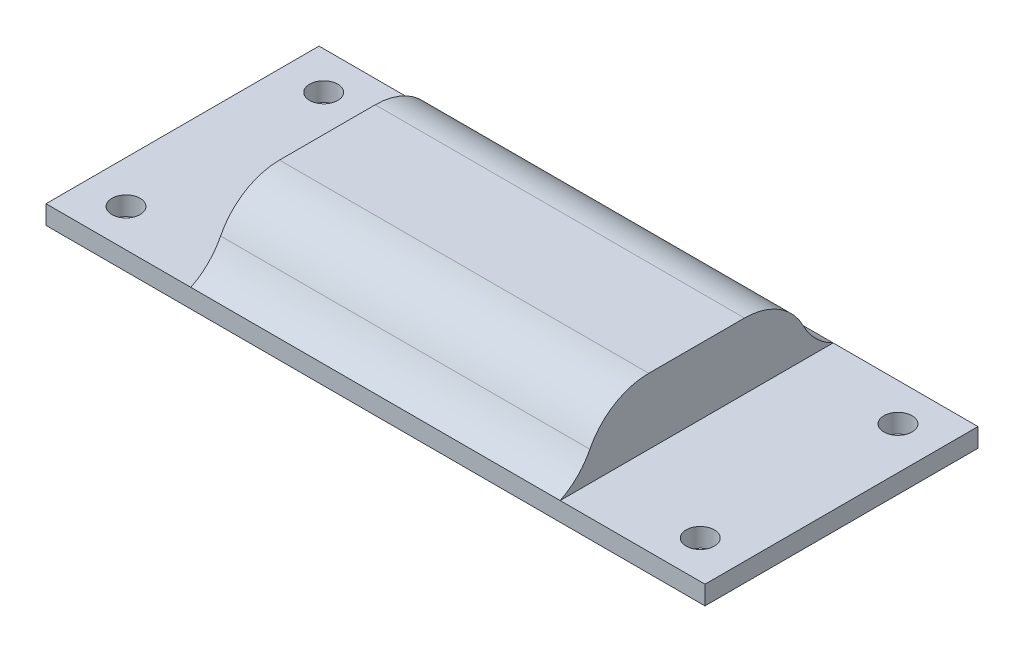
ISO-10303-21;
HEADER;
FILE_DESCRIPTION(('STEP AP214'),'2;1');
FILE_NAME('part.step','',(''),(''),'','','');
FILE_SCHEMA(('AUTOMOTIVE_DESIGN { 1 0 10303 214 1 1 1 1 }'));
ENDSEC;
DATA;
#1=APPLICATION_CONTEXT('core data for automotive mechanical design processes');
#2=APPLICATION_PROTOCOL_DEFINITION('international standard','automotive_design',2000,#1);
#3=PRODUCT_CONTEXT('',#1,'mechanical');
#4=PRODUCT('Part','Part','',(#3));
#5=PRODUCT_RELATED_PRODUCT_CATEGORY('part','',(#4));
#6=PRODUCT_DEFINITION_FORMATION('','',#4);
#7=PRODUCT_DEFINITION_CONTEXT('part definition',#1,'design');
#8=PRODUCT_DEFINITION('design','',#6,#7);
#9=PRODUCT_DEFINITION_SHAPE('','',#8);
#10=(LENGTH_UNIT() NAMED_UNIT(*) SI_UNIT(.MILLI.,.METRE.));
#11=(NAMED_UNIT(*) PLANE_ANGLE_UNIT() SI_UNIT($,.RADIAN.));
#12=(NAMED_UNIT(*) SI_UNIT($,.STERADIAN.) SOLID_ANGLE_UNIT());
#13=UNCERTAINTY_MEASURE_WITH_UNIT(LENGTH_MEASURE(1.E-05),#10,'distance_accuracy_value','');
#14=(GEOMETRIC_REPRESENTATION_CONTEXT(3) GLOBAL_UNCERTAINTY_ASSIGNED_CONTEXT((#13)) GLOBAL_UNIT_ASSIGNED_CONTEXT((#10,
#11,#12)) REPRESENTATION_CONTEXT('',''));
#15=CARTESIAN_POINT('',(0.,0.,0.));
#16=DIRECTION('',(0.,0.,1.));
#17=DIRECTION('',(1.,0.,0.));
#18=AXIS2_PLACEMENT_3D('',#15,#16,#17);
#19=CARTESIAN_POINT('',(0.,2.,0.));
#20=DIRECTION('',(0.,-1.,0.));
#21=DIRECTION('',(0.,0.,-1.));
#22=AXIS2_PLACEMENT_3D('',#19,#20,#21);
#23=PLANE('',#22);
#24=CARTESIAN_POINT('',(-30.499583195,2.,-10.498163925));
#25=DIRECTION('',(0.,1.,0.));
#26=DIRECTION('',(0.,0.,1.));
#27=AXIS2_PLACEMENT_3D('',#24,#25,#26);
#28=CIRCLE('',#27,1.5);
#29=CARTESIAN_POINT('',(-30.499583195,2.,-8.998163925));
#30=VERTEX_POINT('',#29);
#31=EDGE_CURVE('E202',#30,#30,#28,.T.);
#32=ORIENTED_EDGE('',*,*,#31,.F.);
#33=EDGE_LOOP('',(#32));
#34=FACE_BOUND('',#33,.T.);
#35=CARTESIAN_POINT('',(-30.499583195,2.,10.501836075));
#36=DIRECTION('',(0.,1.,0.));
#37=DIRECTION('',(0.,0.,1.));
#38=AXIS2_PLACEMENT_3D('',#35,#36,#37);
#39=CIRCLE('',#38,1.5);
#40=CARTESIAN_POINT('',(-30.499583195,2.,12.001836075));
#41=VERTEX_POINT('',#40);
#42=EDGE_CURVE('E227',#41,#41,#39,.T.);
#43=ORIENTED_EDGE('',*,*,#42,.F.);
#44=EDGE_LOOP('',(#43));
#45=FACE_BOUND('',#44,.T.);
#46=DIRECTION('',(0.,0.,1.));
#47=VECTOR('',#46,1.);
#48=CARTESIAN_POINT('',(-19.6126963921596,2.,-10.5983993965324));
#49=LINE('',#48,#47);
#50=CARTESIAN_POINT('',(-19.6126963921596,2.,-14.5));
#51=VERTEX_POINT('',#50);
#52=CARTESIAN_POINT('',(-19.6126963921596,2.,14.5));
#53=VERTEX_POINT('',#52);
#54=EDGE_CURVE('E247',#51,#53,#49,.T.);
#55=ORIENTED_EDGE('',*,*,#54,.F.);
#56=DIRECTION('',(-1.,0.,0.));
#57=VECTOR('',#56,1.);
#58=CARTESIAN_POINT('',(35.,2.,-14.5));
#59=LINE('',#58,#57);
#60=CARTESIAN_POINT('',(-35.,2.,-14.5));
#61=VERTEX_POINT('',#60);
#62=EDGE_CURVE('E135',#51,#61,#59,.T.);
#63=ORIENTED_EDGE('',*,*,#62,.T.);
#64=DIRECTION('',(0.,0.,1.));
#65=VECTOR('',#64,1.);
#66=CARTESIAN_POINT('',(-35.,2.,-14.5));
#67=LINE('',#66,#65);
#68=CARTESIAN_POINT('',(-35.,2.,14.5));
#69=VERTEX_POINT('',#68);
#70=EDGE_CURVE('E133',#61,#69,#67,.T.);
#71=ORIENTED_EDGE('',*,*,#70,.T.);
#72=DIRECTION('',(1.,0.,0.));
#73=VECTOR('',#72,1.);
#74=CARTESIAN_POINT('',(35.,2.,14.5));
#75=LINE('',#74,#73);
#76=EDGE_CURVE('E117',#69,#53,#75,.T.);
#77=ORIENTED_EDGE('',*,*,#76,.T.);
#78=EDGE_LOOP('',(#55,#63,#71,#77));
#79=FACE_BOUND('',#78,.T.);
#80=ADVANCED_FACE('F38',(#34,#45,#79),#23,.F.);
#81=CARTESIAN_POINT('',(30.500416805,2.,10.501836075));
#82=DIRECTION('',(0.,1.,0.));
#83=DIRECTION('',(0.,0.,1.));
#84=AXIS2_PLACEMENT_3D('',#81,#82,#83);
#85=CIRCLE('',#84,1.50000000000001);
#86=CARTESIAN_POINT('',(30.500416805,2.,12.001836075));
#87=VERTEX_POINT('',#86);
#88=EDGE_CURVE('E239',#87,#87,#85,.T.);
#89=ORIENTED_EDGE('',*,*,#88,.F.);
#90=EDGE_LOOP('',(#89));
#91=FACE_BOUND('',#90,.T.);
#92=CARTESIAN_POINT('',(30.500416805,2.,-10.498163925));
#93=DIRECTION('',(0.,1.,0.));
#94=DIRECTION('',(0.,0.,1.));
#95=AXIS2_PLACEMENT_3D('',#92,#93,#94);
#96=CIRCLE('',#95,1.50000000000001);
#97=CARTESIAN_POINT('',(30.500416805,2.,-8.99816392499999));
#98=VERTEX_POINT('',#97);
#99=EDGE_CURVE('E233',#98,#98,#96,.T.);
#100=ORIENTED_EDGE('',*,*,#99,.F.);
#101=EDGE_LOOP('',(#100));
#102=FACE_BOUND('',#101,.T.);
#103=CARTESIAN_POINT('',(35.,2.,-14.5));
#104=VERTEX_POINT('',#103);
#105=CARTESIAN_POINT('',(19.6126963921596,2.,-14.5));
#106=VERTEX_POINT('',#105);
#107=EDGE_CURVE('E195',#104,#106,#59,.T.);
#108=ORIENTED_EDGE('',*,*,#107,.T.);
#109=DIRECTION('',(0.,0.,-1.));
#110=VECTOR('',#109,1.);
#111=CARTESIAN_POINT('',(19.6126963921596,2.,-10.5983993965324));
#112=LINE('',#111,#110);
#113=CARTESIAN_POINT('',(19.6126963921596,2.,14.5));
#114=VERTEX_POINT('',#113);
#115=EDGE_CURVE('E222',#114,#106,#112,.T.);
#116=ORIENTED_EDGE('',*,*,#115,.F.);
#117=CARTESIAN_POINT('',(35.,2.,14.5));
#118=VERTEX_POINT('',#117);
#119=EDGE_CURVE('E131',#114,#118,#75,.T.);
#120=ORIENTED_EDGE('',*,*,#119,.T.);
#121=DIRECTION('',(0.,0.,-1.));
#122=VECTOR('',#121,1.);
#123=CARTESIAN_POINT('',(35.,2.,-14.5));
#124=LINE('',#123,#122);
#125=EDGE_CURVE('E129',#118,#104,#124,.T.);
#126=ORIENTED_EDGE('',*,*,#125,.T.);
#127=EDGE_LOOP('',(#108,#116,#120,#126));
#128=FACE_BOUND('',#127,.T.);
#129=ADVANCED_FACE('F220',(#91,#102,#128),#23,.F.);
#130=CARTESIAN_POINT('',(0.,0.,0.));
#131=DIRECTION('',(0.,-1.,0.));
#132=DIRECTION('',(0.,0.,-1.));
#133=AXIS2_PLACEMENT_3D('',#130,#131,#132);
#134=PLANE('',#133);
#135=CARTESIAN_POINT('',(30.500416805,0.,-10.498163925));
#136=DIRECTION('',(0.,1.,0.));
#137=DIRECTION('',(0.,0.,1.));
#138=AXIS2_PLACEMENT_3D('',#135,#136,#137);
#139=CIRCLE('',#138,1.50000000000001);
#140=CARTESIAN_POINT('',(30.500416805,0.,-8.99816392499999));
#141=VERTEX_POINT('',#140);
#142=EDGE_CURVE('E236',#141,#141,#139,.T.);
#143=ORIENTED_EDGE('',*,*,#142,.T.);
#144=EDGE_LOOP('',(#143));
#145=FACE_BOUND('',#144,.T.);
#146=CARTESIAN_POINT('',(-30.499583195,0.,-10.498163925));
#147=DIRECTION('',(0.,1.,0.));
#148=DIRECTION('',(0.,0.,1.));
#149=AXIS2_PLACEMENT_3D('',#146,#147,#148);
#150=CIRCLE('',#149,1.5);
#151=CARTESIAN_POINT('',(-30.499583195,0.,-8.998163925));
#152=VERTEX_POINT('',#151);
#153=EDGE_CURVE('E224',#152,#152,#150,.T.);
#154=ORIENTED_EDGE('',*,*,#153,.T.);
#155=EDGE_LOOP('',(#154));
#156=FACE_BOUND('',#155,.T.);
#157=DIRECTION('',(0.,0.,1.));
#158=VECTOR('',#157,1.);
#159=CARTESIAN_POINT('',(-35.,0.,-14.5));
#160=LINE('',#159,#158);
#161=CARTESIAN_POINT('',(-35.,0.,-14.5));
#162=VERTEX_POINT('',#161);
#163=CARTESIAN_POINT('',(-35.,0.,14.5));
#164=VERTEX_POINT('',#163);
#165=EDGE_CURVE('E143',#162,#164,#160,.T.);
#166=ORIENTED_EDGE('',*,*,#165,.F.);
#167=DIRECTION('',(-1.,0.,0.));
#168=VECTOR('',#167,1.);
#169=CARTESIAN_POINT('',(35.,0.,-14.5));
#170=LINE('',#169,#168);
#171=CARTESIAN_POINT('',(35.,0.,-14.5));
#172=VERTEX_POINT('',#171);
#173=EDGE_CURVE('E139',#172,#162,#170,.T.);
#174=ORIENTED_EDGE('',*,*,#173,.F.);
#175=DIRECTION('',(0.,0.,-1.));
#176=VECTOR('',#175,1.);
#177=CARTESIAN_POINT('',(35.,0.,-14.5));
#178=LINE('',#177,#176);
#179=CARTESIAN_POINT('',(35.,0.,14.5));
#180=VERTEX_POINT('',#179);
#181=EDGE_CURVE('E204',#180,#172,#178,.T.);
#182=ORIENTED_EDGE('',*,*,#181,.F.);
#183=DIRECTION('',(1.,0.,0.));
#184=VECTOR('',#183,1.);
#185=CARTESIAN_POINT('',(35.,0.,14.5));
#186=LINE('',#185,#184);
#187=EDGE_CURVE('E201',#164,#180,#186,.T.);
#188=ORIENTED_EDGE('',*,*,#187,.F.);
#189=EDGE_LOOP('',(#166,#174,#182,#188));
#190=FACE_BOUND('',#189,.T.);
#191=CARTESIAN_POINT('',(-30.499583195,0.,10.501836075));
#192=DIRECTION('',(0.,1.,0.));
#193=DIRECTION('',(0.,0.,1.));
#194=AXIS2_PLACEMENT_3D('',#191,#192,#193);
#195=CIRCLE('',#194,1.5);
#196=CARTESIAN_POINT('',(-30.499583195,0.,12.001836075));
#197=VERTEX_POINT('',#196);
#198=EDGE_CURVE('E230',#197,#197,#195,.T.);
#199=ORIENTED_EDGE('',*,*,#198,.T.);
#200=EDGE_LOOP('',(#199));
#201=FACE_BOUND('',#200,.T.);
#202=CARTESIAN_POINT('',(30.500416805,0.,10.501836075));
#203=DIRECTION('',(0.,1.,0.));
#204=DIRECTION('',(0.,0.,1.));
#205=AXIS2_PLACEMENT_3D('',#202,#203,#204);
#206=CIRCLE('',#205,1.50000000000001);
#207=CARTESIAN_POINT('',(30.500416805,0.,12.001836075));
#208=VERTEX_POINT('',#207);
#209=EDGE_CURVE('E182',#208,#208,#206,.T.);
#210=ORIENTED_EDGE('',*,*,#209,.T.);
#211=EDGE_LOOP('',(#210));
#212=FACE_BOUND('',#211,.T.);
#213=ADVANCED_FACE('F215',(#145,#156,#190,#201,#212),#134,.T.);
#214=CARTESIAN_POINT('',(-35.,2.,-14.5));
#215=DIRECTION('',(1.,0.,0.));
#216=DIRECTION('',(0.,0.,-1.));
#217=AXIS2_PLACEMENT_3D('',#214,#215,#216);
#218=PLANE('',#217);
#219=ORIENTED_EDGE('',*,*,#165,.T.);
#220=DIRECTION('',(0.,-1.,0.));
#221=VECTOR('',#220,1.);
#222=CARTESIAN_POINT('',(-35.,2.,14.5));
#223=LINE('',#222,#221);
#224=EDGE_CURVE('E121',#69,#164,#223,.T.);
#225=ORIENTED_EDGE('',*,*,#224,.F.);
#226=ORIENTED_EDGE('',*,*,#70,.F.);
#227=DIRECTION('',(0.,-1.,0.));
#228=VECTOR('',#227,1.);
#229=CARTESIAN_POINT('',(-35.,2.,-14.5));
#230=LINE('',#229,#228);
#231=EDGE_CURVE('E197',#61,#162,#230,.T.);
#232=ORIENTED_EDGE('',*,*,#231,.T.);
#233=EDGE_LOOP('',(#219,#225,#226,#232));
#234=FACE_BOUND('',#233,.T.);
#235=ADVANCED_FACE('F141',(#234),#218,.F.);
#236=CARTESIAN_POINT('',(35.,2.,14.5));
#237=DIRECTION('',(0.,0.,-1.));
#238=DIRECTION('',(-1.,0.,0.));
#239=AXIS2_PLACEMENT_3D('',#236,#237,#238);
#240=PLANE('',#239);
#241=ORIENTED_EDGE('',*,*,#187,.T.);
#242=DIRECTION('',(0.,-1.,0.));
#243=VECTOR('',#242,1.);
#244=CARTESIAN_POINT('',(35.,2.,14.5));
#245=LINE('',#244,#243);
#246=EDGE_CURVE('E145',#118,#180,#245,.T.);
#247=ORIENTED_EDGE('',*,*,#246,.F.);
#248=ORIENTED_EDGE('',*,*,#119,.F.);
#249=EDGE_CURVE('E125',#53,#114,#75,.T.);
#250=ORIENTED_EDGE('',*,*,#249,.F.);
#251=ORIENTED_EDGE('',*,*,#76,.F.);
#252=ORIENTED_EDGE('',*,*,#224,.T.);
#253=EDGE_LOOP('',(#241,#247,#248,#250,#251,#252));
#254=FACE_BOUND('',#253,.T.);
#255=ADVANCED_FACE('F119',(#254),#240,.F.);
#256=CARTESIAN_POINT('',(35.,2.,-14.5));
#257=DIRECTION('',(-1.,0.,0.));
#258=DIRECTION('',(0.,0.,1.));
#259=AXIS2_PLACEMENT_3D('',#256,#257,#258);
#260=PLANE('',#259);
#261=ORIENTED_EDGE('',*,*,#181,.T.);
#262=DIRECTION('',(0.,-1.,0.));
#263=VECTOR('',#262,1.);
#264=CARTESIAN_POINT('',(35.,2.,-14.5));
#265=LINE('',#264,#263);
#266=EDGE_CURVE('E150',#104,#172,#265,.T.);
#267=ORIENTED_EDGE('',*,*,#266,.F.);
#268=ORIENTED_EDGE('',*,*,#125,.F.);
#269=ORIENTED_EDGE('',*,*,#246,.T.);
#270=EDGE_LOOP('',(#261,#267,#268,#269));
#271=FACE_BOUND('',#270,.T.);
#272=ADVANCED_FACE('F218',(#271),#260,.F.);
#273=CARTESIAN_POINT('',(35.,2.,-14.5));
#274=DIRECTION('',(0.,0.,1.));
#275=DIRECTION('',(1.,0.,0.));
#276=AXIS2_PLACEMENT_3D('',#273,#274,#275);
#277=PLANE('',#276);
#278=ORIENTED_EDGE('',*,*,#173,.T.);
#279=ORIENTED_EDGE('',*,*,#231,.F.);
#280=ORIENTED_EDGE('',*,*,#62,.F.);
#281=EDGE_CURVE('E191',#106,#51,#59,.T.);
#282=ORIENTED_EDGE('',*,*,#281,.F.);
#283=ORIENTED_EDGE('',*,*,#107,.F.);
#284=ORIENTED_EDGE('',*,*,#266,.T.);
#285=EDGE_LOOP('',(#278,#279,#280,#282,#283,#284));
#286=FACE_BOUND('',#285,.T.);
#287=ADVANCED_FACE('F210',(#286),#277,.F.);
#288=CARTESIAN_POINT('',(-30.499583195,2.,-10.498163925));
#289=DIRECTION('',(0.,-1.,0.));
#290=DIRECTION('',(0.,0.,-1.));
#291=AXIS2_PLACEMENT_3D('',#288,#289,#290);
#292=CYLINDRICAL_SURFACE('',#291,1.5);
#293=ORIENTED_EDGE('',*,*,#31,.T.);
#294=EDGE_LOOP('',(#293));
#295=FACE_BOUND('',#294,.T.);
#296=ORIENTED_EDGE('',*,*,#153,.F.);
#297=EDGE_LOOP('',(#296));
#298=FACE_BOUND('',#297,.T.);
#299=ADVANCED_FACE('F272',(#295,#298),#292,.F.);
#300=CARTESIAN_POINT('',(-30.499583195,2.,10.501836075));
#301=DIRECTION('',(0.,-1.,0.));
#302=DIRECTION('',(0.,0.,-1.));
#303=AXIS2_PLACEMENT_3D('',#300,#301,#302);
#304=CYLINDRICAL_SURFACE('',#303,1.5);
#305=ORIENTED_EDGE('',*,*,#42,.T.);
#306=EDGE_LOOP('',(#305));
#307=FACE_BOUND('',#306,.T.);
#308=ORIENTED_EDGE('',*,*,#198,.F.);
#309=EDGE_LOOP('',(#308));
#310=FACE_BOUND('',#309,.T.);
#311=ADVANCED_FACE('F308',(#307,#310),#304,.F.);
#312=CARTESIAN_POINT('',(30.500416805,2.,-10.498163925));
#313=DIRECTION('',(0.,-1.,0.));
#314=DIRECTION('',(0.,0.,-1.));
#315=AXIS2_PLACEMENT_3D('',#312,#313,#314);
#316=CYLINDRICAL_SURFACE('',#315,1.50000000000001);
#317=ORIENTED_EDGE('',*,*,#99,.T.);
#318=EDGE_LOOP('',(#317));
#319=FACE_BOUND('',#318,.T.);
#320=ORIENTED_EDGE('',*,*,#142,.F.);
#321=EDGE_LOOP('',(#320));
#322=FACE_BOUND('',#321,.T.);
#323=ADVANCED_FACE('F315',(#319,#322),#316,.F.);
#324=CARTESIAN_POINT('',(30.500416805,2.,10.501836075));
#325=DIRECTION('',(0.,-1.,0.));
#326=DIRECTION('',(0.,0.,-1.));
#327=AXIS2_PLACEMENT_3D('',#324,#325,#326);
#328=CYLINDRICAL_SURFACE('',#327,1.50000000000001);
#329=ORIENTED_EDGE('',*,*,#88,.T.);
#330=EDGE_LOOP('',(#329));
#331=FACE_BOUND('',#330,.T.);
#332=ORIENTED_EDGE('',*,*,#209,.F.);
#333=EDGE_LOOP('',(#332));
#334=FACE_BOUND('',#333,.T.);
#335=ADVANCED_FACE('F322',(#331,#334),#328,.F.);
#336=CARTESIAN_POINT('',(-19.6126963921596,9.,-10.5983993965324));
#337=DIRECTION('',(1.,0.,0.));
#338=DIRECTION('',(0.,0.,-1.));
#339=AXIS2_PLACEMENT_3D('',#336,#337,#338);
#340=PLANE('',#339);
#341=DIRECTION('',(0.,0.,1.));
#342=VECTOR('',#341,1.);
#343=CARTESIAN_POINT('',(-19.6126963921596,9.,-10.5983993965324));
#344=LINE('',#343,#342);
#345=CARTESIAN_POINT('',(-19.6126963921596,9.,-5.08440407847221));
#346=VERTEX_POINT('',#345);
#347=CARTESIAN_POINT('',(-19.6126963921596,9.,5.08440407847222));
#348=VERTEX_POINT('',#347);
#349=EDGE_CURVE('E183',#346,#348,#344,.T.);
#350=ORIENTED_EDGE('',*,*,#349,.F.);
#351=CARTESIAN_POINT('',(-19.6126963921596,2.,-5.08440407847221));
#352=DIRECTION('',(1.,0.,0.));
#353=DIRECTION('',(0.,0.,-1.));
#354=AXIS2_PLACEMENT_3D('',#351,#352,#353);
#355=CIRCLE('',#354,7.);
#356=CARTESIAN_POINT('',(-19.6126963921596,5.13846782600872,-11.3414017375023));
#357=VERTEX_POINT('',#356);
#358=EDGE_CURVE('E168',#346,#357,#355,.F.);
#359=ORIENTED_EDGE('',*,*,#358,.T.);
#360=CARTESIAN_POINT('',(-19.6126963921596,8.27693565201744,-17.5983993965324));
#361=DIRECTION('',(1.,0.,0.));
#362=DIRECTION('',(0.,0.,-1.));
#363=AXIS2_PLACEMENT_3D('',#360,#361,#362);
#364=CIRCLE('',#363,7.);
#365=EDGE_CURVE('E144',#357,#51,#364,.T.);
#366=ORIENTED_EDGE('',*,*,#365,.T.);
#367=ORIENTED_EDGE('',*,*,#54,.T.);
#368=CARTESIAN_POINT('',(-19.6126963921596,8.27693565201744,17.5983993965324));
#369=DIRECTION('',(1.,0.,0.));
#370=DIRECTION('',(0.,0.,-1.));
#371=AXIS2_PLACEMENT_3D('',#368,#369,#370);
#372=CIRCLE('',#371,7.);
#373=CARTESIAN_POINT('',(-19.6126963921596,5.13846782600872,11.3414017375023));
#374=VERTEX_POINT('',#373);
#375=EDGE_CURVE('E157',#53,#374,#372,.T.);
#376=ORIENTED_EDGE('',*,*,#375,.T.);
#377=CARTESIAN_POINT('',(-19.6126963921596,2.,5.08440407847222));
#378=DIRECTION('',(1.,0.,0.));
#379=DIRECTION('',(0.,0.,-1.));
#380=AXIS2_PLACEMENT_3D('',#377,#378,#379);
#381=CIRCLE('',#380,7.);
#382=EDGE_CURVE('E166',#374,#348,#381,.F.);
#383=ORIENTED_EDGE('',*,*,#382,.T.);
#384=EDGE_LOOP('',(#350,#359,#366,#367,#376,#383));
#385=FACE_BOUND('',#384,.T.);
#386=ADVANCED_FACE('F187',(#385),#340,.F.);
#387=CARTESIAN_POINT('',(19.6126963921596,9.,-10.5983993965324));
#388=DIRECTION('',(-1.,0.,0.));
#389=DIRECTION('',(0.,0.,1.));
#390=AXIS2_PLACEMENT_3D('',#387,#388,#389);
#391=PLANE('',#390);
#392=CARTESIAN_POINT('',(19.6126963921596,8.27693565201744,-17.5983993965324));
#393=DIRECTION('',(-1.,0.,0.));
#394=DIRECTION('',(0.,0.,1.));
#395=AXIS2_PLACEMENT_3D('',#392,#393,#394);
#396=CIRCLE('',#395,7.);
#397=CARTESIAN_POINT('',(19.6126963921596,5.13846782600872,-11.3414017375023));
#398=VERTEX_POINT('',#397);
#399=EDGE_CURVE('E147',#106,#398,#396,.T.);
#400=ORIENTED_EDGE('',*,*,#399,.T.);
#401=CARTESIAN_POINT('',(19.6126963921596,2.,-5.08440407847222));
#402=DIRECTION('',(-1.,0.,0.));
#403=DIRECTION('',(0.,0.,1.));
#404=AXIS2_PLACEMENT_3D('',#401,#402,#403);
#405=CIRCLE('',#404,7.);
#406=CARTESIAN_POINT('',(19.6126963921596,9.,-5.08440407847222));
#407=VERTEX_POINT('',#406);
#408=EDGE_CURVE('E46',#398,#407,#405,.F.);
#409=ORIENTED_EDGE('',*,*,#408,.T.);
#410=DIRECTION('',(0.,0.,-1.));
#411=VECTOR('',#410,1.);
#412=CARTESIAN_POINT('',(19.6126963921596,9.,-10.5983993965324));
#413=LINE('',#412,#411);
#414=CARTESIAN_POINT('',(19.6126963921596,9.,5.08440407847222));
#415=VERTEX_POINT('',#414);
#416=EDGE_CURVE('E174',#415,#407,#413,.T.);
#417=ORIENTED_EDGE('',*,*,#416,.F.);
#418=CARTESIAN_POINT('',(19.6126963921596,2.,5.08440407847222));
#419=DIRECTION('',(-1.,0.,0.));
#420=DIRECTION('',(0.,0.,1.));
#421=AXIS2_PLACEMENT_3D('',#418,#419,#420);
#422=CIRCLE('',#421,7.);
#423=CARTESIAN_POINT('',(19.6126963921596,5.13846782600872,11.3414017375023));
#424=VERTEX_POINT('',#423);
#425=EDGE_CURVE('E53',#415,#424,#422,.F.);
#426=ORIENTED_EDGE('',*,*,#425,.T.);
#427=CARTESIAN_POINT('',(19.6126963921596,8.27693565201744,17.5983993965324));
#428=DIRECTION('',(-1.,0.,0.));
#429=DIRECTION('',(0.,0.,1.));
#430=AXIS2_PLACEMENT_3D('',#427,#428,#429);
#431=CIRCLE('',#430,7.);
#432=EDGE_CURVE('E155',#424,#114,#431,.T.);
#433=ORIENTED_EDGE('',*,*,#432,.T.);
#434=ORIENTED_EDGE('',*,*,#115,.T.);
#435=EDGE_LOOP('',(#400,#409,#417,#426,#433,#434));
#436=FACE_BOUND('',#435,.T.);
#437=ADVANCED_FACE('F173',(#436),#391,.F.);
#438=CARTESIAN_POINT('',(0.,9.,0.));
#439=DIRECTION('',(0.,-1.,0.));
#440=DIRECTION('',(0.,0.,-1.));
#441=AXIS2_PLACEMENT_3D('',#438,#439,#440);
#442=PLANE('',#441);
#443=ORIENTED_EDGE('',*,*,#416,.T.);
#444=DIRECTION('',(-1.,0.,0.));
#445=VECTOR('',#444,1.);
#446=CARTESIAN_POINT('',(0.,9.,-5.08440407847222));
#447=LINE('',#446,#445);
#448=EDGE_CURVE('E163',#407,#346,#447,.T.);
#449=ORIENTED_EDGE('',*,*,#448,.T.);
#450=ORIENTED_EDGE('',*,*,#349,.T.);
#451=DIRECTION('',(1.,0.,0.));
#452=VECTOR('',#451,1.);
#453=CARTESIAN_POINT('',(0.,9.,5.08440407847222));
#454=LINE('',#453,#452);
#455=EDGE_CURVE('E160',#348,#415,#454,.T.);
#456=ORIENTED_EDGE('',*,*,#455,.T.);
#457=EDGE_LOOP('',(#443,#449,#450,#456));
#458=FACE_BOUND('',#457,.T.);
#459=ADVANCED_FACE('F178',(#458),#442,.F.);
#460=CARTESIAN_POINT('',(0.,8.27693565201744,-17.5983993965324));
#461=DIRECTION('',(-1.,0.,0.));
#462=DIRECTION('',(0.,0.,1.));
#463=AXIS2_PLACEMENT_3D('',#460,#461,#462);
#464=CYLINDRICAL_SURFACE('',#463,7.);
#465=ORIENTED_EDGE('',*,*,#365,.F.);
#466=DIRECTION('',(-1.,0.,0.));
#467=VECTOR('',#466,1.);
#468=CARTESIAN_POINT('',(0.,5.13846782600872,-11.3414017375023));
#469=LINE('',#468,#467);
#470=EDGE_CURVE('E61',#357,#398,#469,.F.);
#471=ORIENTED_EDGE('',*,*,#470,.T.);
#472=ORIENTED_EDGE('',*,*,#399,.F.);
#473=ORIENTED_EDGE('',*,*,#281,.T.);
#474=EDGE_LOOP('',(#465,#471,#472,#473));
#475=FACE_BOUND('',#474,.T.);
#476=ADVANCED_FACE('F189',(#475),#464,.F.);
#477=CARTESIAN_POINT('',(0.,8.27693565201744,17.5983993965324));
#478=DIRECTION('',(1.,0.,0.));
#479=DIRECTION('',(0.,0.,-1.));
#480=AXIS2_PLACEMENT_3D('',#477,#478,#479);
#481=CYLINDRICAL_SURFACE('',#480,7.);
#482=ORIENTED_EDGE('',*,*,#432,.F.);
#483=DIRECTION('',(1.,0.,0.));
#484=VECTOR('',#483,1.);
#485=CARTESIAN_POINT('',(0.,5.13846782600872,11.3414017375023));
#486=LINE('',#485,#484);
#487=EDGE_CURVE('E11',#424,#374,#486,.F.);
#488=ORIENTED_EDGE('',*,*,#487,.T.);
#489=ORIENTED_EDGE('',*,*,#375,.F.);
#490=ORIENTED_EDGE('',*,*,#249,.T.);
#491=EDGE_LOOP('',(#482,#488,#489,#490));
#492=FACE_BOUND('',#491,.T.);
#493=ADVANCED_FACE('F253',(#492),#481,.F.);
#494=CARTESIAN_POINT('',(0.,2.,-5.08440407847222));
#495=DIRECTION('',(-1.,0.,0.));
#496=DIRECTION('',(0.,0.,1.));
#497=AXIS2_PLACEMENT_3D('',#494,#495,#496);
#498=CYLINDRICAL_SURFACE('',#497,7.);
#499=ORIENTED_EDGE('',*,*,#408,.F.);
#500=ORIENTED_EDGE('',*,*,#470,.F.);
#501=ORIENTED_EDGE('',*,*,#358,.F.);
#502=ORIENTED_EDGE('',*,*,#448,.F.);
#503=EDGE_LOOP('',(#499,#500,#501,#502));
#504=FACE_BOUND('',#503,.T.);
#505=ADVANCED_FACE('F185',(#504),#498,.T.);
#506=CARTESIAN_POINT('',(0.,2.,5.08440407847222));
#507=DIRECTION('',(1.,0.,0.));
#508=DIRECTION('',(0.,0.,-1.));
#509=AXIS2_PLACEMENT_3D('',#506,#507,#508);
#510=CYLINDRICAL_SURFACE('',#509,7.);
#511=ORIENTED_EDGE('',*,*,#382,.F.);
#512=ORIENTED_EDGE('',*,*,#487,.F.);
#513=ORIENTED_EDGE('',*,*,#425,.F.);
#514=ORIENTED_EDGE('',*,*,#455,.F.);
#515=EDGE_LOOP('',(#511,#512,#513,#514));
#516=FACE_BOUND('',#515,.T.);
#517=ADVANCED_FACE('F40',(#516),#510,.T.);
#518=CLOSED_SHELL('',(#80,#129,#213,#235,#255,#272,#287,#299,#311,#323,#335,#386,#437,#459,#476,
#493,#505,#517));
#519=MANIFOLD_SOLID_BREP('B2',#518);
#520=ADVANCED_BREP_SHAPE_REPRESENTATION('',(#18,#519),#14);
#521=SHAPE_DEFINITION_REPRESENTATION(#9,#520);
ENDSEC;
END-ISO-10303-21;
